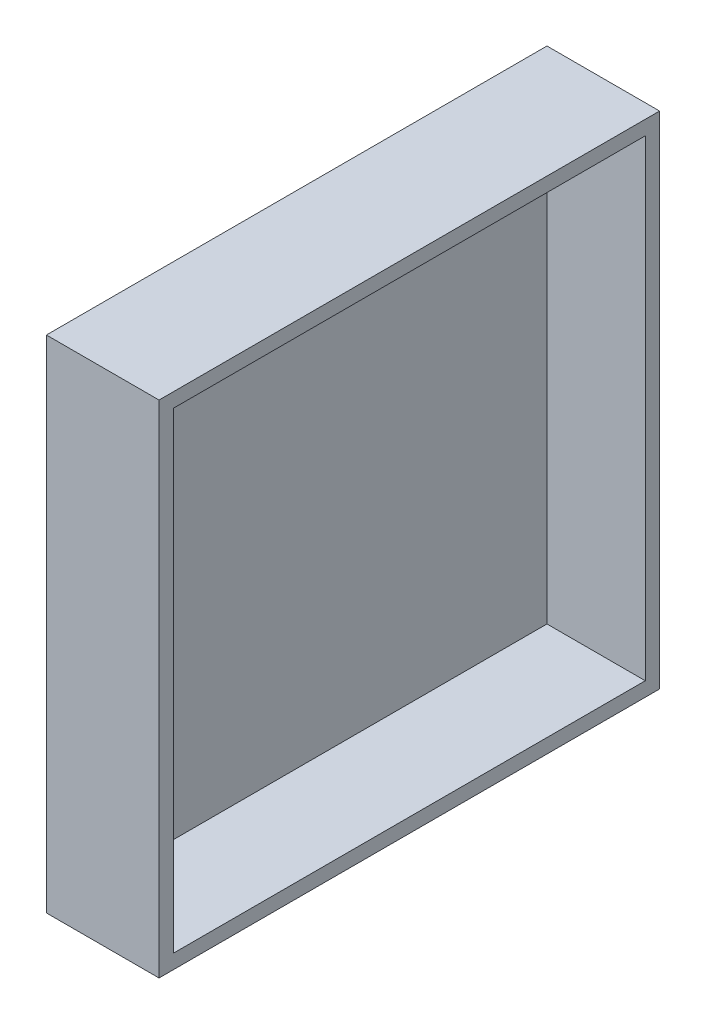
ISO-10303-21;
HEADER;
FILE_DESCRIPTION(('STEP AP214'),'2;1');
FILE_NAME('part.step','',(''),(''),'','','');
FILE_SCHEMA(('AUTOMOTIVE_DESIGN { 1 0 10303 214 1 1 1 1 }'));
ENDSEC;
DATA;
#1=APPLICATION_CONTEXT('core data for automotive mechanical design processes');
#2=APPLICATION_PROTOCOL_DEFINITION('international standard','automotive_design',2000,#1);
#3=PRODUCT_CONTEXT('',#1,'mechanical');
#4=PRODUCT('Part','Part','',(#3));
#5=PRODUCT_RELATED_PRODUCT_CATEGORY('part','',(#4));
#6=PRODUCT_DEFINITION_FORMATION('','',#4);
#7=PRODUCT_DEFINITION_CONTEXT('part definition',#1,'design');
#8=PRODUCT_DEFINITION('design','',#6,#7);
#9=PRODUCT_DEFINITION_SHAPE('','',#8);
#10=(LENGTH_UNIT() NAMED_UNIT(*) SI_UNIT(.MILLI.,.METRE.));
#11=(NAMED_UNIT(*) PLANE_ANGLE_UNIT() SI_UNIT($,.RADIAN.));
#12=(NAMED_UNIT(*) SI_UNIT($,.STERADIAN.) SOLID_ANGLE_UNIT());
#13=UNCERTAINTY_MEASURE_WITH_UNIT(LENGTH_MEASURE(1.E-05),#10,'distance_accuracy_value','');
#14=(GEOMETRIC_REPRESENTATION_CONTEXT(3) GLOBAL_UNCERTAINTY_ASSIGNED_CONTEXT((#13)) GLOBAL_UNIT_ASSIGNED_CONTEXT((#10,
#11,#12)) REPRESENTATION_CONTEXT('',''));
#15=CARTESIAN_POINT('',(0.,0.,0.));
#16=DIRECTION('',(0.,0.,1.));
#17=DIRECTION('',(1.,0.,0.));
#18=AXIS2_PLACEMENT_3D('',#15,#16,#17);
#19=CARTESIAN_POINT('',(63.,140.,140.));
#20=DIRECTION('',(0.,0.,-1.));
#21=DIRECTION('',(-1.,0.,0.));
#22=AXIS2_PLACEMENT_3D('',#19,#20,#21);
#23=PLANE('',#22);
#24=DIRECTION('',(0.,-1.,0.));
#25=VECTOR('',#24,1.);
#26=CARTESIAN_POINT('',(0.,140.,140.));
#27=LINE('',#26,#25);
#28=CARTESIAN_POINT('',(0.,140.,140.));
#29=VERTEX_POINT('',#28);
#30=CARTESIAN_POINT('',(0.,-140.,140.));
#31=VERTEX_POINT('',#30);
#32=EDGE_CURVE('E150',#29,#31,#27,.T.);
#33=ORIENTED_EDGE('',*,*,#32,.T.);
#34=DIRECTION('',(-1.,0.,0.));
#35=VECTOR('',#34,1.);
#36=CARTESIAN_POINT('',(63.,-140.,140.));
#37=LINE('',#36,#35);
#38=CARTESIAN_POINT('',(63.,-140.,140.));
#39=VERTEX_POINT('',#38);
#40=EDGE_CURVE('E11',#39,#31,#37,.T.);
#41=ORIENTED_EDGE('',*,*,#40,.F.);
#42=DIRECTION('',(0.,-1.,0.));
#43=VECTOR('',#42,1.);
#44=CARTESIAN_POINT('',(63.,140.,140.));
#45=LINE('',#44,#43);
#46=CARTESIAN_POINT('',(63.,140.,140.));
#47=VERTEX_POINT('',#46);
#48=EDGE_CURVE('E154',#47,#39,#45,.T.);
#49=ORIENTED_EDGE('',*,*,#48,.F.);
#50=DIRECTION('',(-1.,0.,0.));
#51=VECTOR('',#50,1.);
#52=CARTESIAN_POINT('',(63.,140.,140.));
#53=LINE('',#52,#51);
#54=EDGE_CURVE('E160',#47,#29,#53,.T.);
#55=ORIENTED_EDGE('',*,*,#54,.T.);
#56=EDGE_LOOP('',(#33,#41,#49,#55));
#57=FACE_BOUND('',#56,.T.);
#58=ADVANCED_FACE('F39',(#57),#23,.F.);
#59=CARTESIAN_POINT('',(63.,-140.,-140.));
#60=DIRECTION('',(0.,1.,0.));
#61=DIRECTION('',(0.,0.,1.));
#62=AXIS2_PLACEMENT_3D('',#59,#60,#61);
#63=PLANE('',#62);
#64=DIRECTION('',(0.,0.,-1.));
#65=VECTOR('',#64,1.);
#66=CARTESIAN_POINT('',(0.,-140.,-140.));
#67=LINE('',#66,#65);
#68=CARTESIAN_POINT('',(0.,-140.,-140.));
#69=VERTEX_POINT('',#68);
#70=EDGE_CURVE('E163',#31,#69,#67,.T.);
#71=ORIENTED_EDGE('',*,*,#70,.T.);
#72=DIRECTION('',(-1.,0.,0.));
#73=VECTOR('',#72,1.);
#74=CARTESIAN_POINT('',(63.,-140.,-140.));
#75=LINE('',#74,#73);
#76=CARTESIAN_POINT('',(63.,-140.,-140.));
#77=VERTEX_POINT('',#76);
#78=EDGE_CURVE('E46',#77,#69,#75,.T.);
#79=ORIENTED_EDGE('',*,*,#78,.F.);
#80=DIRECTION('',(0.,0.,-1.));
#81=VECTOR('',#80,1.);
#82=CARTESIAN_POINT('',(63.,-140.,-140.));
#83=LINE('',#82,#81);
#84=EDGE_CURVE('E90',#39,#77,#83,.T.);
#85=ORIENTED_EDGE('',*,*,#84,.F.);
#86=ORIENTED_EDGE('',*,*,#40,.T.);
#87=EDGE_LOOP('',(#71,#79,#85,#86));
#88=FACE_BOUND('',#87,.T.);
#89=ADVANCED_FACE('F192',(#88),#63,.F.);
#90=CARTESIAN_POINT('',(63.,140.,-140.));
#91=DIRECTION('',(0.,0.,1.));
#92=DIRECTION('',(0.,-1.,0.));
#93=AXIS2_PLACEMENT_3D('',#90,#91,#92);
#94=PLANE('',#93);
#95=DIRECTION('',(0.,1.,0.));
#96=VECTOR('',#95,1.);
#97=CARTESIAN_POINT('',(0.,140.,-140.));
#98=LINE('',#97,#96);
#99=CARTESIAN_POINT('',(0.,140.,-140.));
#100=VERTEX_POINT('',#99);
#101=EDGE_CURVE('E165',#69,#100,#98,.T.);
#102=ORIENTED_EDGE('',*,*,#101,.T.);
#103=DIRECTION('',(-1.,0.,0.));
#104=VECTOR('',#103,1.);
#105=CARTESIAN_POINT('',(63.,140.,-140.));
#106=LINE('',#105,#104);
#107=CARTESIAN_POINT('',(63.,140.,-140.));
#108=VERTEX_POINT('',#107);
#109=EDGE_CURVE('E169',#108,#100,#106,.T.);
#110=ORIENTED_EDGE('',*,*,#109,.F.);
#111=DIRECTION('',(0.,1.,0.));
#112=VECTOR('',#111,1.);
#113=CARTESIAN_POINT('',(63.,140.,-140.));
#114=LINE('',#113,#112);
#115=EDGE_CURVE('E157',#77,#108,#114,.T.);
#116=ORIENTED_EDGE('',*,*,#115,.F.);
#117=ORIENTED_EDGE('',*,*,#78,.T.);
#118=EDGE_LOOP('',(#102,#110,#116,#117));
#119=FACE_BOUND('',#118,.T.);
#120=ADVANCED_FACE('F174',(#119),#94,.F.);
#121=CARTESIAN_POINT('',(63.,140.,-140.));
#122=DIRECTION('',(0.,-1.,0.));
#123=DIRECTION('',(0.,0.,-1.));
#124=AXIS2_PLACEMENT_3D('',#121,#122,#123);
#125=PLANE('',#124);
#126=DIRECTION('',(0.,0.,1.));
#127=VECTOR('',#126,1.);
#128=CARTESIAN_POINT('',(0.,140.,-140.));
#129=LINE('',#128,#127);
#130=EDGE_CURVE('E83',#100,#29,#129,.T.);
#131=ORIENTED_EDGE('',*,*,#130,.T.);
#132=ORIENTED_EDGE('',*,*,#54,.F.);
#133=DIRECTION('',(0.,0.,1.));
#134=VECTOR('',#133,1.);
#135=CARTESIAN_POINT('',(63.,140.,-140.));
#136=LINE('',#135,#134);
#137=EDGE_CURVE('E62',#108,#47,#136,.T.);
#138=ORIENTED_EDGE('',*,*,#137,.F.);
#139=ORIENTED_EDGE('',*,*,#109,.T.);
#140=EDGE_LOOP('',(#131,#132,#138,#139));
#141=FACE_BOUND('',#140,.T.);
#142=ADVANCED_FACE('F182',(#141),#125,.F.);
#143=CARTESIAN_POINT('',(63.,0.,0.));
#144=DIRECTION('',(-1.,0.,0.));
#145=DIRECTION('',(0.,0.,1.));
#146=AXIS2_PLACEMENT_3D('',#143,#144,#145);
#147=PLANE('',#146);
#148=DIRECTION('',(0.,0.,-1.));
#149=VECTOR('',#148,1.);
#150=CARTESIAN_POINT('',(63.,-132.,-132.));
#151=LINE('',#150,#149);
#152=CARTESIAN_POINT('',(63.,-132.,132.));
#153=VERTEX_POINT('',#152);
#154=CARTESIAN_POINT('',(63.,-132.,-132.));
#155=VERTEX_POINT('',#154);
#156=EDGE_CURVE('E144',#153,#155,#151,.T.);
#157=ORIENTED_EDGE('',*,*,#156,.F.);
#158=DIRECTION('',(0.,-1.,0.));
#159=VECTOR('',#158,1.);
#160=CARTESIAN_POINT('',(63.,132.,132.));
#161=LINE('',#160,#159);
#162=CARTESIAN_POINT('',(63.,132.,132.));
#163=VERTEX_POINT('',#162);
#164=EDGE_CURVE('E53',#163,#153,#161,.T.);
#165=ORIENTED_EDGE('',*,*,#164,.F.);
#166=DIRECTION('',(0.,0.,1.));
#167=VECTOR('',#166,1.);
#168=CARTESIAN_POINT('',(63.,132.,-132.));
#169=LINE('',#168,#167);
#170=CARTESIAN_POINT('',(63.,132.,-132.));
#171=VERTEX_POINT('',#170);
#172=EDGE_CURVE('E132',#171,#163,#169,.T.);
#173=ORIENTED_EDGE('',*,*,#172,.F.);
#174=DIRECTION('',(0.,1.,0.));
#175=VECTOR('',#174,1.);
#176=CARTESIAN_POINT('',(63.,132.,-132.));
#177=LINE('',#176,#175);
#178=EDGE_CURVE('E135',#155,#171,#177,.T.);
#179=ORIENTED_EDGE('',*,*,#178,.F.);
#180=EDGE_LOOP('',(#157,#165,#173,#179));
#181=FACE_BOUND('',#180,.T.);
#182=ORIENTED_EDGE('',*,*,#48,.T.);
#183=ORIENTED_EDGE('',*,*,#84,.T.);
#184=ORIENTED_EDGE('',*,*,#115,.T.);
#185=ORIENTED_EDGE('',*,*,#137,.T.);
#186=EDGE_LOOP('',(#182,#183,#184,#185));
#187=FACE_BOUND('',#186,.T.);
#188=ADVANCED_FACE('F184',(#181,#187),#147,.F.);
#189=CARTESIAN_POINT('',(0.,0.,0.));
#190=DIRECTION('',(-1.,0.,0.));
#191=DIRECTION('',(0.,0.,1.));
#192=AXIS2_PLACEMENT_3D('',#189,#190,#191);
#193=PLANE('',#192);
#194=CARTESIAN_POINT('',(0.,107.,-107.));
#195=DIRECTION('',(-1.,0.,0.));
#196=DIRECTION('',(0.,0.,1.));
#197=AXIS2_PLACEMENT_3D('',#194,#195,#196);
#198=CIRCLE('',#197,15.);
#199=CARTESIAN_POINT('',(0.,107.,-92.));
#200=VERTEX_POINT('',#199);
#201=EDGE_CURVE('E138',#200,#200,#198,.T.);
#202=ORIENTED_EDGE('',*,*,#201,.F.);
#203=EDGE_LOOP('',(#202));
#204=FACE_BOUND('',#203,.T.);
#205=ORIENTED_EDGE('',*,*,#32,.F.);
#206=ORIENTED_EDGE('',*,*,#130,.F.);
#207=ORIENTED_EDGE('',*,*,#101,.F.);
#208=ORIENTED_EDGE('',*,*,#70,.F.);
#209=EDGE_LOOP('',(#205,#206,#207,#208));
#210=FACE_BOUND('',#209,.T.);
#211=ADVANCED_FACE('F178',(#204,#210),#193,.T.);
#212=CARTESIAN_POINT('',(8.,132.,132.));
#213=DIRECTION('',(0.,0.,1.));
#214=DIRECTION('',(1.,0.,0.));
#215=AXIS2_PLACEMENT_3D('',#212,#213,#214);
#216=PLANE('',#215);
#217=ORIENTED_EDGE('',*,*,#164,.T.);
#218=DIRECTION('',(1.,0.,0.));
#219=VECTOR('',#218,1.);
#220=CARTESIAN_POINT('',(8.,-132.,132.));
#221=LINE('',#220,#219);
#222=CARTESIAN_POINT('',(8.,-132.,132.));
#223=VERTEX_POINT('',#222);
#224=EDGE_CURVE('E110',#223,#153,#221,.T.);
#225=ORIENTED_EDGE('',*,*,#224,.F.);
#226=DIRECTION('',(0.,-1.,0.));
#227=VECTOR('',#226,1.);
#228=CARTESIAN_POINT('',(8.,132.,132.));
#229=LINE('',#228,#227);
#230=CARTESIAN_POINT('',(8.,132.,132.));
#231=VERTEX_POINT('',#230);
#232=EDGE_CURVE('E114',#231,#223,#229,.T.);
#233=ORIENTED_EDGE('',*,*,#232,.F.);
#234=DIRECTION('',(1.,0.,0.));
#235=VECTOR('',#234,1.);
#236=CARTESIAN_POINT('',(8.,132.,132.));
#237=LINE('',#236,#235);
#238=EDGE_CURVE('E148',#231,#163,#237,.T.);
#239=ORIENTED_EDGE('',*,*,#238,.T.);
#240=EDGE_LOOP('',(#217,#225,#233,#239));
#241=FACE_BOUND('',#240,.T.);
#242=ADVANCED_FACE('F112',(#241),#216,.F.);
#243=CARTESIAN_POINT('',(8.,132.,-132.));
#244=DIRECTION('',(0.,1.,0.));
#245=DIRECTION('',(0.,0.,1.));
#246=AXIS2_PLACEMENT_3D('',#243,#244,#245);
#247=PLANE('',#246);
#248=ORIENTED_EDGE('',*,*,#172,.T.);
#249=ORIENTED_EDGE('',*,*,#238,.F.);
#250=DIRECTION('',(0.,0.,1.));
#251=VECTOR('',#250,1.);
#252=CARTESIAN_POINT('',(8.,132.,-132.));
#253=LINE('',#252,#251);
#254=CARTESIAN_POINT('',(8.,132.,-132.));
#255=VERTEX_POINT('',#254);
#256=EDGE_CURVE('E120',#255,#231,#253,.T.);
#257=ORIENTED_EDGE('',*,*,#256,.F.);
#258=DIRECTION('',(1.,0.,0.));
#259=VECTOR('',#258,1.);
#260=CARTESIAN_POINT('',(8.,132.,-132.));
#261=LINE('',#260,#259);
#262=EDGE_CURVE('E151',#255,#171,#261,.T.);
#263=ORIENTED_EDGE('',*,*,#262,.T.);
#264=EDGE_LOOP('',(#248,#249,#257,#263));
#265=FACE_BOUND('',#264,.T.);
#266=ADVANCED_FACE('F236',(#265),#247,.F.);
#267=CARTESIAN_POINT('',(8.,132.,-132.));
#268=DIRECTION('',(0.,0.,-1.));
#269=DIRECTION('',(-1.,0.,0.));
#270=AXIS2_PLACEMENT_3D('',#267,#268,#269);
#271=PLANE('',#270);
#272=ORIENTED_EDGE('',*,*,#178,.T.);
#273=ORIENTED_EDGE('',*,*,#262,.F.);
#274=DIRECTION('',(0.,1.,0.));
#275=VECTOR('',#274,1.);
#276=CARTESIAN_POINT('',(8.,132.,-132.));
#277=LINE('',#276,#275);
#278=CARTESIAN_POINT('',(8.,-132.,-132.));
#279=VERTEX_POINT('',#278);
#280=EDGE_CURVE('E128',#279,#255,#277,.T.);
#281=ORIENTED_EDGE('',*,*,#280,.F.);
#282=DIRECTION('',(1.,0.,0.));
#283=VECTOR('',#282,1.);
#284=CARTESIAN_POINT('',(8.,-132.,-132.));
#285=LINE('',#284,#283);
#286=EDGE_CURVE('E119',#279,#155,#285,.T.);
#287=ORIENTED_EDGE('',*,*,#286,.T.);
#288=EDGE_LOOP('',(#272,#273,#281,#287));
#289=FACE_BOUND('',#288,.T.);
#290=ADVANCED_FACE('F245',(#289),#271,.F.);
#291=CARTESIAN_POINT('',(8.,-132.,-132.));
#292=DIRECTION('',(0.,-1.,0.));
#293=DIRECTION('',(0.,0.,-1.));
#294=AXIS2_PLACEMENT_3D('',#291,#292,#293);
#295=PLANE('',#294);
#296=ORIENTED_EDGE('',*,*,#156,.T.);
#297=ORIENTED_EDGE('',*,*,#286,.F.);
#298=DIRECTION('',(0.,0.,-1.));
#299=VECTOR('',#298,1.);
#300=CARTESIAN_POINT('',(8.,-132.,-132.));
#301=LINE('',#300,#299);
#302=EDGE_CURVE('E123',#223,#279,#301,.T.);
#303=ORIENTED_EDGE('',*,*,#302,.F.);
#304=ORIENTED_EDGE('',*,*,#224,.T.);
#305=EDGE_LOOP('',(#296,#297,#303,#304));
#306=FACE_BOUND('',#305,.T.);
#307=ADVANCED_FACE('F124',(#306),#295,.F.);
#308=CARTESIAN_POINT('',(8.,0.,0.));
#309=DIRECTION('',(-1.,0.,0.));
#310=DIRECTION('',(0.,0.,1.));
#311=AXIS2_PLACEMENT_3D('',#308,#309,#310);
#312=PLANE('',#311);
#313=CARTESIAN_POINT('',(8.,107.,-107.));
#314=DIRECTION('',(1.,0.,0.));
#315=DIRECTION('',(0.,0.,-1.));
#316=AXIS2_PLACEMENT_3D('',#313,#314,#315);
#317=CIRCLE('',#316,15.);
#318=CARTESIAN_POINT('',(8.,107.,-122.));
#319=VERTEX_POINT('',#318);
#320=EDGE_CURVE('E288',#319,#319,#317,.T.);
#321=ORIENTED_EDGE('',*,*,#320,.F.);
#322=EDGE_LOOP('',(#321));
#323=FACE_BOUND('',#322,.T.);
#324=ORIENTED_EDGE('',*,*,#232,.T.);
#325=ORIENTED_EDGE('',*,*,#302,.T.);
#326=ORIENTED_EDGE('',*,*,#280,.T.);
#327=ORIENTED_EDGE('',*,*,#256,.T.);
#328=EDGE_LOOP('',(#324,#325,#326,#327));
#329=FACE_BOUND('',#328,.T.);
#330=ADVANCED_FACE('F130',(#323,#329),#312,.F.);
#331=CARTESIAN_POINT('',(-47.,107.,-107.));
#332=DIRECTION('',(1.,0.,0.));
#333=DIRECTION('',(0.,0.,-1.));
#334=AXIS2_PLACEMENT_3D('',#331,#332,#333);
#335=CYLINDRICAL_SURFACE('',#334,15.);
#336=ORIENTED_EDGE('',*,*,#201,.T.);
#337=EDGE_LOOP('',(#336));
#338=FACE_BOUND('',#337,.T.);
#339=ORIENTED_EDGE('',*,*,#320,.T.);
#340=EDGE_LOOP('',(#339));
#341=FACE_BOUND('',#340,.T.);
#342=ADVANCED_FACE('F270',(#338,#341),#335,.F.);
#343=CLOSED_SHELL('',(#58,#89,#120,#142,#188,#211,#242,#266,#290,#307,#330,#342));
#344=MANIFOLD_SOLID_BREP('B2',#343);
#345=ADVANCED_BREP_SHAPE_REPRESENTATION('',(#18,#344),#14);
#346=SHAPE_DEFINITION_REPRESENTATION(#9,#345);
ENDSEC;
END-ISO-10303-21;
